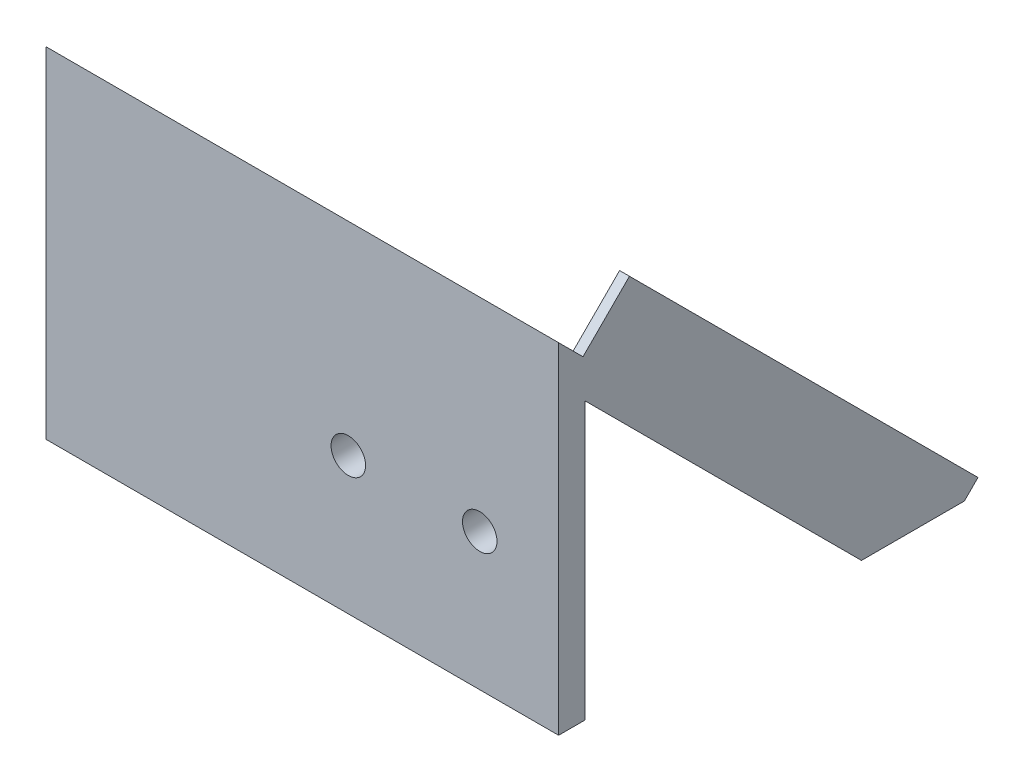
ISO-10303-21;
HEADER;
FILE_DESCRIPTION(('STEP AP214'),'2;1');
FILE_NAME('part.step','',(''),(''),'','','');
FILE_SCHEMA(('AUTOMOTIVE_DESIGN { 1 0 10303 214 1 1 1 1 }'));
ENDSEC;
DATA;
#1=APPLICATION_CONTEXT('core data for automotive mechanical design processes');
#2=APPLICATION_PROTOCOL_DEFINITION('international standard','automotive_design',2000,#1);
#3=PRODUCT_CONTEXT('',#1,'mechanical');
#4=PRODUCT('Part','Part','',(#3));
#5=PRODUCT_RELATED_PRODUCT_CATEGORY('part','',(#4));
#6=PRODUCT_DEFINITION_FORMATION('','',#4);
#7=PRODUCT_DEFINITION_CONTEXT('part definition',#1,'design');
#8=PRODUCT_DEFINITION('design','',#6,#7);
#9=PRODUCT_DEFINITION_SHAPE('','',#8);
#10=(LENGTH_UNIT() NAMED_UNIT(*) SI_UNIT(.MILLI.,.METRE.));
#11=(NAMED_UNIT(*) PLANE_ANGLE_UNIT() SI_UNIT($,.RADIAN.));
#12=(NAMED_UNIT(*) SI_UNIT($,.STERADIAN.) SOLID_ANGLE_UNIT());
#13=UNCERTAINTY_MEASURE_WITH_UNIT(LENGTH_MEASURE(1.E-05),#10,'distance_accuracy_value','');
#14=(GEOMETRIC_REPRESENTATION_CONTEXT(3) GLOBAL_UNCERTAINTY_ASSIGNED_CONTEXT((#13)) GLOBAL_UNIT_ASSIGNED_CONTEXT((#10,
#11,#12)) REPRESENTATION_CONTEXT('',''));
#15=CARTESIAN_POINT('',(0.,0.,0.));
#16=DIRECTION('',(0.,0.,1.));
#17=DIRECTION('',(1.,0.,0.));
#18=AXIS2_PLACEMENT_3D('',#15,#16,#17);
#19=CARTESIAN_POINT('',(78.,56.74,0.));
#20=DIRECTION('',(0.,-0.707106781186548,0.707106781186547));
#21=DIRECTION('',(0.,-0.707106781186547,-0.707106781186548));
#22=AXIS2_PLACEMENT_3D('',#19,#20,#21);
#23=PLANE('',#22);
#24=DIRECTION('',(0.,0.707106781186547,0.707106781186548));
#25=VECTOR('',#24,1.);
#26=CARTESIAN_POINT('',(76.5,0.,-56.7400000000001));
#27=LINE('',#26,#25);
#28=CARTESIAN_POINT('',(76.5,5.,-51.7400000000001));
#29=VERTEX_POINT('',#28);
#30=CARTESIAN_POINT('',(76.5,53.033008588991,-3.70699141100899));
#31=VERTEX_POINT('',#30);
#32=EDGE_CURVE('E202',#29,#31,#27,.T.);
#33=ORIENTED_EDGE('',*,*,#32,.F.);
#34=DIRECTION('',(-1.,0.,0.));
#35=VECTOR('',#34,1.);
#36=CARTESIAN_POINT('',(78.,5.00000000000001,-51.7400000000001));
#37=LINE('',#36,#35);
#38=CARTESIAN_POINT('',(0.,4.99999999999999,-51.7400000000001));
#39=VERTEX_POINT('',#38);
#40=EDGE_CURVE('E62',#29,#39,#37,.T.);
#41=ORIENTED_EDGE('',*,*,#40,.T.);
#42=DIRECTION('',(0.,0.707106781186547,0.707106781186548));
#43=VECTOR('',#42,1.);
#44=CARTESIAN_POINT('',(0.,56.74,0.));
#45=LINE('',#44,#43);
#46=CARTESIAN_POINT('',(0.,56.74,0.));
#47=VERTEX_POINT('',#46);
#48=EDGE_CURVE('E155',#39,#47,#45,.T.);
#49=ORIENTED_EDGE('',*,*,#48,.T.);
#50=DIRECTION('',(-1.,0.,0.));
#51=VECTOR('',#50,1.);
#52=CARTESIAN_POINT('',(78.,56.74,0.));
#53=LINE('',#52,#51);
#54=CARTESIAN_POINT('',(78.,56.74,0.));
#55=VERTEX_POINT('',#54);
#56=EDGE_CURVE('E138',#55,#47,#53,.T.);
#57=ORIENTED_EDGE('',*,*,#56,.F.);
#58=DIRECTION('',(0.,0.707106781186547,0.707106781186548));
#59=VECTOR('',#58,1.);
#60=CARTESIAN_POINT('',(78.,56.74,0.));
#61=LINE('',#60,#59);
#62=CARTESIAN_POINT('',(78.,53.033008588991,-3.70699141100899));
#63=VERTEX_POINT('',#62);
#64=EDGE_CURVE('E135',#63,#55,#61,.T.);
#65=ORIENTED_EDGE('',*,*,#64,.F.);
#66=DIRECTION('',(1.,0.,0.));
#67=VECTOR('',#66,1.);
#68=CARTESIAN_POINT('',(78.,53.033008588991,-3.70699141100899));
#69=LINE('',#68,#67);
#70=EDGE_CURVE('E214',#31,#63,#69,.T.);
#71=ORIENTED_EDGE('',*,*,#70,.F.);
#72=EDGE_LOOP('',(#33,#41,#49,#57,#65,#71));
#73=FACE_BOUND('',#72,.T.);
#74=ADVANCED_FACE('F38',(#73),#23,.F.);
#75=CARTESIAN_POINT('',(78.,0.,-4.));
#76=DIRECTION('',(0.,0.,1.));
#77=DIRECTION('',(1.,0.,0.));
#78=AXIS2_PLACEMENT_3D('',#75,#76,#77);
#79=PLANE('',#78);
#80=CARTESIAN_POINT('',(66.,25.86,-4.));
#81=DIRECTION('',(0.,0.,1.));
#82=DIRECTION('',(1.,0.,0.));
#83=AXIS2_PLACEMENT_3D('',#80,#81,#82);
#84=CIRCLE('',#83,2.625);
#85=CARTESIAN_POINT('',(68.625,25.86,-4.00000000000001));
#86=VERTEX_POINT('',#85);
#87=EDGE_CURVE('E197',#86,#86,#84,.F.);
#88=ORIENTED_EDGE('',*,*,#87,.F.);
#89=EDGE_LOOP('',(#88));
#90=FACE_BOUND('',#89,.T.);
#91=CARTESIAN_POINT('',(46.,25.86,-4.));
#92=DIRECTION('',(0.,0.,1.));
#93=DIRECTION('',(1.,0.,0.));
#94=AXIS2_PLACEMENT_3D('',#91,#92,#93);
#95=CIRCLE('',#94,2.62499999999999);
#96=CARTESIAN_POINT('',(48.625,25.86,-4.00000000000001));
#97=VERTEX_POINT('',#96);
#98=EDGE_CURVE('E198',#97,#97,#95,.F.);
#99=ORIENTED_EDGE('',*,*,#98,.F.);
#100=EDGE_LOOP('',(#99));
#101=FACE_BOUND('',#100,.T.);
#102=DIRECTION('',(0.,1.,0.));
#103=VECTOR('',#102,1.);
#104=CARTESIAN_POINT('',(78.,0.,-4.));
#105=LINE('',#104,#103);
#106=CARTESIAN_POINT('',(78.,5.,-4.));
#107=VERTEX_POINT('',#106);
#108=CARTESIAN_POINT('',(78.,47.08,-4.));
#109=VERTEX_POINT('',#108);
#110=EDGE_CURVE('E159',#107,#109,#105,.T.);
#111=ORIENTED_EDGE('',*,*,#110,.F.);
#112=DIRECTION('',(-1.,0.,0.));
#113=VECTOR('',#112,1.);
#114=CARTESIAN_POINT('',(78.,5.,-4.));
#115=LINE('',#114,#113);
#116=CARTESIAN_POINT('',(0.,4.99999999999999,-4.));
#117=VERTEX_POINT('',#116);
#118=EDGE_CURVE('E116',#107,#117,#115,.T.);
#119=ORIENTED_EDGE('',*,*,#118,.T.);
#120=DIRECTION('',(0.,1.,0.));
#121=VECTOR('',#120,1.);
#122=CARTESIAN_POINT('',(0.,0.,-4.));
#123=LINE('',#122,#121);
#124=CARTESIAN_POINT('',(0.,47.08,-4.));
#125=VERTEX_POINT('',#124);
#126=EDGE_CURVE('E147',#117,#125,#123,.T.);
#127=ORIENTED_EDGE('',*,*,#126,.T.);
#128=DIRECTION('',(-1.,0.,0.));
#129=VECTOR('',#128,1.);
#130=CARTESIAN_POINT('',(78.,47.08,-4.));
#131=LINE('',#130,#129);
#132=EDGE_CURVE('E47',#109,#125,#131,.T.);
#133=ORIENTED_EDGE('',*,*,#132,.F.);
#134=EDGE_LOOP('',(#111,#119,#127,#133));
#135=FACE_BOUND('',#134,.T.);
#136=ADVANCED_FACE('F40',(#90,#101,#135),#79,.F.);
#137=CARTESIAN_POINT('',(78.,47.08,-4.));
#138=DIRECTION('',(0.,0.707106781186553,-0.707106781186542));
#139=DIRECTION('',(0.,0.707106781186542,0.707106781186553));
#140=AXIS2_PLACEMENT_3D('',#137,#138,#139);
#141=PLANE('',#140);
#142=DIRECTION('',(0.,-0.707106781186542,-0.707106781186553));
#143=VECTOR('',#142,1.);
#144=CARTESIAN_POINT('',(0.,47.08,-4.));
#145=LINE('',#144,#143);
#146=CARTESIAN_POINT('',(0.,4.99999999999999,-46.0800000000006));
#147=VERTEX_POINT('',#146);
#148=EDGE_CURVE('E150',#125,#147,#145,.T.);
#149=ORIENTED_EDGE('',*,*,#148,.T.);
#150=DIRECTION('',(1.,0.,0.));
#151=VECTOR('',#150,1.);
#152=CARTESIAN_POINT('',(78.,5.,-46.0800000000006));
#153=LINE('',#152,#151);
#154=CARTESIAN_POINT('',(78.,5.,-46.0800000000006));
#155=VERTEX_POINT('',#154);
#156=EDGE_CURVE('E187',#147,#155,#153,.T.);
#157=ORIENTED_EDGE('',*,*,#156,.T.);
#158=DIRECTION('',(0.,-0.707106781186542,-0.707106781186553));
#159=VECTOR('',#158,1.);
#160=CARTESIAN_POINT('',(78.,47.08,-4.));
#161=LINE('',#160,#159);
#162=EDGE_CURVE('E143',#109,#155,#161,.T.);
#163=ORIENTED_EDGE('',*,*,#162,.F.);
#164=ORIENTED_EDGE('',*,*,#132,.T.);
#165=EDGE_LOOP('',(#149,#157,#163,#164));
#166=FACE_BOUND('',#165,.T.);
#167=ADVANCED_FACE('F166',(#166),#141,.F.);
#168=CARTESIAN_POINT('',(78.,0.,0.));
#169=DIRECTION('',(0.,0.,-1.));
#170=DIRECTION('',(-1.,0.,0.));
#171=AXIS2_PLACEMENT_3D('',#168,#169,#170);
#172=PLANE('',#171);
#173=CARTESIAN_POINT('',(66.,25.86,0.));
#174=DIRECTION('',(0.,0.,1.));
#175=DIRECTION('',(1.,0.,0.));
#176=AXIS2_PLACEMENT_3D('',#173,#174,#175);
#177=CIRCLE('',#176,2.625);
#178=CARTESIAN_POINT('',(68.625,25.86,0.));
#179=VERTEX_POINT('',#178);
#180=EDGE_CURVE('E193',#179,#179,#177,.T.);
#181=ORIENTED_EDGE('',*,*,#180,.F.);
#182=EDGE_LOOP('',(#181));
#183=FACE_BOUND('',#182,.T.);
#184=CARTESIAN_POINT('',(46.,25.86,0.));
#185=DIRECTION('',(0.,0.,1.));
#186=DIRECTION('',(1.,0.,0.));
#187=AXIS2_PLACEMENT_3D('',#184,#185,#186);
#188=CIRCLE('',#187,2.62499999999999);
#189=CARTESIAN_POINT('',(48.625,25.86,0.));
#190=VERTEX_POINT('',#189);
#191=EDGE_CURVE('E192',#190,#190,#188,.T.);
#192=ORIENTED_EDGE('',*,*,#191,.F.);
#193=EDGE_LOOP('',(#192));
#194=FACE_BOUND('',#193,.T.);
#195=DIRECTION('',(0.,-1.,0.));
#196=VECTOR('',#195,1.);
#197=CARTESIAN_POINT('',(0.,0.,0.));
#198=LINE('',#197,#196);
#199=CARTESIAN_POINT('',(0.,5.,0.));
#200=VERTEX_POINT('',#199);
#201=EDGE_CURVE('E130',#47,#200,#198,.T.);
#202=ORIENTED_EDGE('',*,*,#201,.T.);
#203=DIRECTION('',(-1.,0.,0.));
#204=VECTOR('',#203,1.);
#205=CARTESIAN_POINT('',(78.,5.,0.));
#206=LINE('',#205,#204);
#207=CARTESIAN_POINT('',(78.,5.,0.));
#208=VERTEX_POINT('',#207);
#209=EDGE_CURVE('E54',#208,#200,#206,.T.);
#210=ORIENTED_EDGE('',*,*,#209,.F.);
#211=DIRECTION('',(0.,-1.,0.));
#212=VECTOR('',#211,1.);
#213=CARTESIAN_POINT('',(78.,0.,0.));
#214=LINE('',#213,#212);
#215=EDGE_CURVE('E128',#55,#208,#214,.T.);
#216=ORIENTED_EDGE('',*,*,#215,.F.);
#217=ORIENTED_EDGE('',*,*,#56,.T.);
#218=EDGE_LOOP('',(#202,#210,#216,#217));
#219=FACE_BOUND('',#218,.T.);
#220=ADVANCED_FACE('F126',(#183,#194,#219),#172,.F.);
#221=CARTESIAN_POINT('',(78.,0.,0.));
#222=DIRECTION('',(-1.,0.,0.));
#223=DIRECTION('',(0.,0.,1.));
#224=AXIS2_PLACEMENT_3D('',#221,#222,#223);
#225=PLANE('',#224);
#226=ORIENTED_EDGE('',*,*,#215,.T.);
#227=DIRECTION('',(0.,0.,1.));
#228=VECTOR('',#227,1.);
#229=CARTESIAN_POINT('',(78.,5.,-63.8110678118656));
#230=LINE('',#229,#228);
#231=EDGE_CURVE('E113',#107,#208,#230,.T.);
#232=ORIENTED_EDGE('',*,*,#231,.F.);
#233=ORIENTED_EDGE('',*,*,#110,.T.);
#234=ORIENTED_EDGE('',*,*,#162,.T.);
#235=CARTESIAN_POINT('',(78.,5.,-61.7400000000001));
#236=VERTEX_POINT('',#235);
#237=EDGE_CURVE('E121',#236,#155,#230,.T.);
#238=ORIENTED_EDGE('',*,*,#237,.F.);
#239=DIRECTION('',(0.,-0.707106781186548,0.707106781186547));
#240=VECTOR('',#239,1.);
#241=CARTESIAN_POINT('',(78.,7.0710678118655,-63.8110678118656));
#242=LINE('',#241,#240);
#243=CARTESIAN_POINT('',(78.,7.0710678118655,-63.8110678118656));
#244=VERTEX_POINT('',#243);
#245=EDGE_CURVE('E151',#244,#236,#242,.T.);
#246=ORIENTED_EDGE('',*,*,#245,.F.);
#247=DIRECTION('',(0.,-0.707106781186547,-0.707106781186548));
#248=VECTOR('',#247,1.);
#249=CARTESIAN_POINT('',(78.,7.0710678118655,-63.8110678118656));
#250=LINE('',#249,#248);
#251=CARTESIAN_POINT('',(78.,60.1040764008565,-10.7780592228745));
#252=VERTEX_POINT('',#251);
#253=EDGE_CURVE('E209',#252,#244,#250,.T.);
#254=ORIENTED_EDGE('',*,*,#253,.F.);
#255=DIRECTION('',(0.,-0.707106781186548,0.707106781186547));
#256=VECTOR('',#255,1.);
#257=CARTESIAN_POINT('',(78.,60.1040764008565,-10.7780592228745));
#258=LINE('',#257,#256);
#259=EDGE_CURVE('E223',#252,#63,#258,.T.);
#260=ORIENTED_EDGE('',*,*,#259,.T.);
#261=ORIENTED_EDGE('',*,*,#64,.T.);
#262=EDGE_LOOP('',(#226,#232,#233,#234,#238,#246,#254,#260,#261));
#263=FACE_BOUND('',#262,.T.);
#264=ADVANCED_FACE('F133',(#263),#225,.F.);
#265=CARTESIAN_POINT('',(0.,0.,0.));
#266=DIRECTION('',(-1.,0.,0.));
#267=DIRECTION('',(0.,0.,1.));
#268=AXIS2_PLACEMENT_3D('',#265,#266,#267);
#269=PLANE('',#268);
#270=DIRECTION('',(0.,0.,1.));
#271=VECTOR('',#270,1.);
#272=CARTESIAN_POINT('',(0.,4.99999999999999,-63.8110678118656));
#273=LINE('',#272,#271);
#274=EDGE_CURVE('E178',#117,#200,#273,.T.);
#275=ORIENTED_EDGE('',*,*,#274,.T.);
#276=ORIENTED_EDGE('',*,*,#201,.F.);
#277=ORIENTED_EDGE('',*,*,#48,.F.);
#278=EDGE_CURVE('E175',#39,#147,#273,.T.);
#279=ORIENTED_EDGE('',*,*,#278,.T.);
#280=ORIENTED_EDGE('',*,*,#148,.F.);
#281=ORIENTED_EDGE('',*,*,#126,.F.);
#282=EDGE_LOOP('',(#275,#276,#277,#279,#280,#281));
#283=FACE_BOUND('',#282,.T.);
#284=ADVANCED_FACE('F173',(#283),#269,.T.);
#285=CARTESIAN_POINT('',(78.,7.0710678118655,-63.8110678118656));
#286=DIRECTION('',(0.,0.707106781186547,0.707106781186548));
#287=DIRECTION('',(0.,-0.707106781186548,0.707106781186547));
#288=AXIS2_PLACEMENT_3D('',#285,#286,#287);
#289=PLANE('',#288);
#290=ORIENTED_EDGE('',*,*,#245,.T.);
#291=DIRECTION('',(-1.,0.,0.));
#292=VECTOR('',#291,1.);
#293=CARTESIAN_POINT('',(78.,5.,-61.7400000000001));
#294=LINE('',#293,#292);
#295=CARTESIAN_POINT('',(76.5,5.,-61.7400000000001));
#296=VERTEX_POINT('',#295);
#297=EDGE_CURVE('E177',#236,#296,#294,.T.);
#298=ORIENTED_EDGE('',*,*,#297,.T.);
#299=DIRECTION('',(0.,-0.707106781186548,0.707106781186547));
#300=VECTOR('',#299,1.);
#301=CARTESIAN_POINT('',(76.5,7.0710678118655,-63.8110678118656));
#302=LINE('',#301,#300);
#303=CARTESIAN_POINT('',(76.5,7.0710678118655,-63.8110678118656));
#304=VERTEX_POINT('',#303);
#305=EDGE_CURVE('E235',#304,#296,#302,.T.);
#306=ORIENTED_EDGE('',*,*,#305,.F.);
#307=DIRECTION('',(-1.,0.,0.));
#308=VECTOR('',#307,1.);
#309=CARTESIAN_POINT('',(78.,7.0710678118655,-63.8110678118656));
#310=LINE('',#309,#308);
#311=EDGE_CURVE('E213',#244,#304,#310,.T.);
#312=ORIENTED_EDGE('',*,*,#311,.F.);
#313=EDGE_LOOP('',(#290,#298,#306,#312));
#314=FACE_BOUND('',#313,.T.);
#315=ADVANCED_FACE('F282',(#314),#289,.F.);
#316=CARTESIAN_POINT('',(76.5,7.0710678118655,-63.8110678118656));
#317=DIRECTION('',(1.,0.,0.));
#318=DIRECTION('',(0.,0.,-1.));
#319=AXIS2_PLACEMENT_3D('',#316,#317,#318);
#320=PLANE('',#319);
#321=ORIENTED_EDGE('',*,*,#305,.T.);
#322=DIRECTION('',(0.,0.,1.));
#323=VECTOR('',#322,1.);
#324=CARTESIAN_POINT('',(76.5,5.,-63.8110678118656));
#325=LINE('',#324,#323);
#326=EDGE_CURVE('E11',#296,#29,#325,.T.);
#327=ORIENTED_EDGE('',*,*,#326,.T.);
#328=ORIENTED_EDGE('',*,*,#32,.T.);
#329=DIRECTION('',(0.,-0.707106781186548,0.707106781186547));
#330=VECTOR('',#329,1.);
#331=CARTESIAN_POINT('',(76.5,60.1040764008565,-10.7780592228745));
#332=LINE('',#331,#330);
#333=CARTESIAN_POINT('',(76.5,60.1040764008565,-10.7780592228745));
#334=VERTEX_POINT('',#333);
#335=EDGE_CURVE('E231',#334,#31,#332,.T.);
#336=ORIENTED_EDGE('',*,*,#335,.F.);
#337=DIRECTION('',(0.,0.707106781186547,0.707106781186548));
#338=VECTOR('',#337,1.);
#339=CARTESIAN_POINT('',(76.5,7.0710678118655,-63.8110678118656));
#340=LINE('',#339,#338);
#341=EDGE_CURVE('E217',#304,#334,#340,.T.);
#342=ORIENTED_EDGE('',*,*,#341,.F.);
#343=EDGE_LOOP('',(#321,#327,#328,#336,#342));
#344=FACE_BOUND('',#343,.T.);
#345=ADVANCED_FACE('F278',(#344),#320,.F.);
#346=CARTESIAN_POINT('',(78.,60.1040764008565,-10.7780592228745));
#347=DIRECTION('',(0.,-0.707106781186547,-0.707106781186548));
#348=DIRECTION('',(0.,0.707106781186548,-0.707106781186547));
#349=AXIS2_PLACEMENT_3D('',#346,#347,#348);
#350=PLANE('',#349);
#351=ORIENTED_EDGE('',*,*,#70,.T.);
#352=ORIENTED_EDGE('',*,*,#259,.F.);
#353=DIRECTION('',(1.,0.,0.));
#354=VECTOR('',#353,1.);
#355=CARTESIAN_POINT('',(78.,60.1040764008565,-10.7780592228745));
#356=LINE('',#355,#354);
#357=EDGE_CURVE('E220',#334,#252,#356,.T.);
#358=ORIENTED_EDGE('',*,*,#357,.F.);
#359=ORIENTED_EDGE('',*,*,#335,.T.);
#360=EDGE_LOOP('',(#351,#352,#358,#359));
#361=FACE_BOUND('',#360,.T.);
#362=ADVANCED_FACE('F271',(#361),#350,.F.);
#363=CARTESIAN_POINT('',(0.,35.4410678118655,-35.4410678118655));
#364=DIRECTION('',(0.,-0.707106781186548,0.707106781186547));
#365=DIRECTION('',(0.,-0.707106781186547,-0.707106781186548));
#366=AXIS2_PLACEMENT_3D('',#363,#364,#365);
#367=PLANE('',#366);
#368=ORIENTED_EDGE('',*,*,#253,.T.);
#369=ORIENTED_EDGE('',*,*,#311,.T.);
#370=ORIENTED_EDGE('',*,*,#341,.T.);
#371=ORIENTED_EDGE('',*,*,#357,.T.);
#372=EDGE_LOOP('',(#368,#369,#370,#371));
#373=FACE_BOUND('',#372,.T.);
#374=ADVANCED_FACE('F261',(#373),#367,.F.);
#375=CARTESIAN_POINT('',(46.,25.86,-63.8120678118656));
#376=DIRECTION('',(0.,0.,1.));
#377=DIRECTION('',(1.,0.,0.));
#378=AXIS2_PLACEMENT_3D('',#375,#376,#377);
#379=CYLINDRICAL_SURFACE('',#378,2.62499999999999);
#380=CARTESIAN_POINT('',(48.625,25.86,0.));
#381=CARTESIAN_POINT('',(48.625,25.86,-0.0416666666666805));
#382=CARTESIAN_POINT('',(48.625,25.86,-0.0833333333333473));
#383=CARTESIAN_POINT('',(48.625,25.86,-0.166666666666681));
#384=CARTESIAN_POINT('',(48.625,25.86,-0.208333333333347));
#385=CARTESIAN_POINT('',(48.625,25.86,-0.291666666666681));
#386=CARTESIAN_POINT('',(48.625,25.86,-0.333333333333347));
#387=CARTESIAN_POINT('',(48.625,25.86,-0.416666666666681));
#388=CARTESIAN_POINT('',(48.625,25.86,-0.458333333333348));
#389=CARTESIAN_POINT('',(48.625,25.86,-0.541666666666681));
#390=CARTESIAN_POINT('',(48.625,25.86,-0.583333333333348));
#391=CARTESIAN_POINT('',(48.625,25.86,-0.666666666666681));
#392=CARTESIAN_POINT('',(48.625,25.86,-0.708333333333348));
#393=CARTESIAN_POINT('',(48.625,25.86,-0.791666666666681));
#394=CARTESIAN_POINT('',(48.625,25.86,-0.833333333333348));
#395=CARTESIAN_POINT('',(48.625,25.86,-0.916666666666681));
#396=CARTESIAN_POINT('',(48.625,25.86,-0.958333333333348));
#397=CARTESIAN_POINT('',(48.625,25.86,-1.04166666666668));
#398=CARTESIAN_POINT('',(48.625,25.86,-1.08333333333335));
#399=CARTESIAN_POINT('',(48.625,25.86,-1.16666666666668));
#400=CARTESIAN_POINT('',(48.625,25.86,-1.20833333333335));
#401=CARTESIAN_POINT('',(48.625,25.86,-1.29166666666668));
#402=CARTESIAN_POINT('',(48.625,25.86,-1.33333333333334));
#403=CARTESIAN_POINT('',(48.625,25.86,-1.41666666666667));
#404=CARTESIAN_POINT('',(48.625,25.86,-1.45833333333334));
#405=CARTESIAN_POINT('',(48.625,25.86,-1.54166666666667));
#406=CARTESIAN_POINT('',(48.625,25.86,-1.58333333333334));
#407=CARTESIAN_POINT('',(48.625,25.86,-1.66666666666667));
#408=CARTESIAN_POINT('',(48.625,25.86,-1.70833333333334));
#409=CARTESIAN_POINT('',(48.625,25.86,-1.79166666666668));
#410=CARTESIAN_POINT('',(48.625,25.86,-1.83333333333334));
#411=CARTESIAN_POINT('',(48.625,25.86,-1.91666666666668));
#412=CARTESIAN_POINT('',(48.625,25.86,-1.95833333333334));
#413=CARTESIAN_POINT('',(48.625,25.86,-2.04166666666668));
#414=CARTESIAN_POINT('',(48.625,25.86,-2.08333333333334));
#415=CARTESIAN_POINT('',(48.625,25.86,-2.16666666666668));
#416=CARTESIAN_POINT('',(48.625,25.86,-2.20833333333334));
#417=CARTESIAN_POINT('',(48.625,25.86,-2.29166666666668));
#418=CARTESIAN_POINT('',(48.625,25.86,-2.33333333333334));
#419=CARTESIAN_POINT('',(48.625,25.86,-2.41666666666668));
#420=CARTESIAN_POINT('',(48.625,25.86,-2.45833333333334));
#421=CARTESIAN_POINT('',(48.625,25.86,-2.54166666666668));
#422=CARTESIAN_POINT('',(48.625,25.86,-2.58333333333334));
#423=CARTESIAN_POINT('',(48.625,25.86,-2.66666666666668));
#424=CARTESIAN_POINT('',(48.625,25.86,-2.70833333333334));
#425=CARTESIAN_POINT('',(48.625,25.86,-2.79166666666668));
#426=CARTESIAN_POINT('',(48.625,25.86,-2.83333333333334));
#427=CARTESIAN_POINT('',(48.625,25.86,-2.91666666666668));
#428=CARTESIAN_POINT('',(48.625,25.86,-2.95833333333334));
#429=CARTESIAN_POINT('',(48.625,25.86,-3.04166666666668));
#430=CARTESIAN_POINT('',(48.625,25.86,-3.08333333333334));
#431=CARTESIAN_POINT('',(48.625,25.86,-3.16666666666668));
#432=CARTESIAN_POINT('',(48.625,25.86,-3.20833333333334));
#433=CARTESIAN_POINT('',(48.625,25.86,-3.29166666666668));
#434=CARTESIAN_POINT('',(48.625,25.86,-3.33333333333334));
#435=CARTESIAN_POINT('',(48.625,25.86,-3.41666666666668));
#436=CARTESIAN_POINT('',(48.625,25.86,-3.45833333333334));
#437=CARTESIAN_POINT('',(48.625,25.86,-3.54166666666668));
#438=CARTESIAN_POINT('',(48.625,25.86,-3.58333333333334));
#439=CARTESIAN_POINT('',(48.625,25.86,-3.66666666666668));
#440=CARTESIAN_POINT('',(48.625,25.86,-3.70833333333334));
#441=CARTESIAN_POINT('',(48.625,25.86,-3.79166666666668));
#442=CARTESIAN_POINT('',(48.625,25.86,-3.83333333333334));
#443=CARTESIAN_POINT('',(48.625,25.86,-3.91666666666668));
#444=CARTESIAN_POINT('',(48.625,25.86,-3.95833333333334));
#445=CARTESIAN_POINT('',(48.625,25.86,-4.00000000000001));
#446=B_SPLINE_CURVE_WITH_KNOTS('',3,(#380,#381,#382,#383,#384,#385,#386,#387,#388,#389,#390,
#391,#392,#393,#394,#395,#396,#397,#398,#399,#400,#401,#402,#403,#404,#405,#406,#407,#408,#409,
#410,#411,#412,#413,#414,#415,#416,#417,#418,#419,#420,#421,#422,#423,#424,#425,#426,#427,#428,
#429,#430,#431,#432,#433,#434,#435,#436,#437,#438,#439,#440,#441,#442,#443,#444,#445),
.UNSPECIFIED.,.F.,.F.,(4,2,2,2,2,2,2,2,2,2,2,2,2,2,2,2,2,2,2,2,2,2,2,2,2,2,2,2,2,2,2,2,4),(0.,
0.125,0.25,0.375,0.5,0.625000000000001,0.750000000000001,0.875000000000001,1.,1.125,1.25,
1.37499999999999,1.49999999999999,1.62499999999999,1.74999999999999,1.87499999999999,
1.99999999999999,2.125,2.25,2.375,2.5,2.625,2.75,2.875,3.,3.125,3.25,3.375,3.5,3.625,3.75,3.875,
4.),.UNSPECIFIED.);
#447=EDGE_CURVE('BSEAM258',#190,#97,#446,.T.);
#448=ORIENTED_EDGE('',*,*,#191,.T.);
#449=ORIENTED_EDGE('',*,*,#98,.T.);
#450=ORIENTED_EDGE('',*,*,#447,.T.);
#451=ORIENTED_EDGE('',*,*,#447,.F.);
#452=EDGE_LOOP('',(#448,#450,#449,#451));
#453=FACE_BOUND('',#452,.T.);
#454=ADVANCED_FACE('F258',(#453),#379,.F.);
#455=CARTESIAN_POINT('',(66.,25.86,-63.8120678118656));
#456=DIRECTION('',(0.,0.,1.));
#457=DIRECTION('',(1.,0.,0.));
#458=AXIS2_PLACEMENT_3D('',#455,#456,#457);
#459=CYLINDRICAL_SURFACE('',#458,2.625);
#460=CARTESIAN_POINT('',(68.625,25.86,0.));
#461=CARTESIAN_POINT('',(68.625,25.86,-0.0416666666666805));
#462=CARTESIAN_POINT('',(68.625,25.86,-0.0833333333333473));
#463=CARTESIAN_POINT('',(68.625,25.86,-0.166666666666681));
#464=CARTESIAN_POINT('',(68.625,25.86,-0.208333333333347));
#465=CARTESIAN_POINT('',(68.625,25.86,-0.291666666666681));
#466=CARTESIAN_POINT('',(68.625,25.86,-0.333333333333347));
#467=CARTESIAN_POINT('',(68.625,25.86,-0.416666666666681));
#468=CARTESIAN_POINT('',(68.625,25.86,-0.458333333333348));
#469=CARTESIAN_POINT('',(68.625,25.86,-0.541666666666681));
#470=CARTESIAN_POINT('',(68.625,25.86,-0.583333333333348));
#471=CARTESIAN_POINT('',(68.625,25.86,-0.666666666666681));
#472=CARTESIAN_POINT('',(68.625,25.86,-0.708333333333348));
#473=CARTESIAN_POINT('',(68.625,25.86,-0.791666666666681));
#474=CARTESIAN_POINT('',(68.625,25.86,-0.833333333333348));
#475=CARTESIAN_POINT('',(68.625,25.86,-0.916666666666681));
#476=CARTESIAN_POINT('',(68.625,25.86,-0.958333333333348));
#477=CARTESIAN_POINT('',(68.625,25.86,-1.04166666666668));
#478=CARTESIAN_POINT('',(68.625,25.86,-1.08333333333335));
#479=CARTESIAN_POINT('',(68.625,25.86,-1.16666666666668));
#480=CARTESIAN_POINT('',(68.625,25.86,-1.20833333333335));
#481=CARTESIAN_POINT('',(68.625,25.86,-1.29166666666668));
#482=CARTESIAN_POINT('',(68.625,25.86,-1.33333333333334));
#483=CARTESIAN_POINT('',(68.625,25.86,-1.41666666666667));
#484=CARTESIAN_POINT('',(68.625,25.86,-1.45833333333334));
#485=CARTESIAN_POINT('',(68.625,25.86,-1.54166666666667));
#486=CARTESIAN_POINT('',(68.625,25.86,-1.58333333333334));
#487=CARTESIAN_POINT('',(68.625,25.86,-1.66666666666667));
#488=CARTESIAN_POINT('',(68.625,25.86,-1.70833333333334));
#489=CARTESIAN_POINT('',(68.625,25.86,-1.79166666666668));
#490=CARTESIAN_POINT('',(68.625,25.86,-1.83333333333334));
#491=CARTESIAN_POINT('',(68.625,25.86,-1.91666666666668));
#492=CARTESIAN_POINT('',(68.625,25.86,-1.95833333333334));
#493=CARTESIAN_POINT('',(68.625,25.86,-2.04166666666668));
#494=CARTESIAN_POINT('',(68.625,25.86,-2.08333333333334));
#495=CARTESIAN_POINT('',(68.625,25.86,-2.16666666666668));
#496=CARTESIAN_POINT('',(68.625,25.86,-2.20833333333334));
#497=CARTESIAN_POINT('',(68.625,25.86,-2.29166666666668));
#498=CARTESIAN_POINT('',(68.625,25.86,-2.33333333333334));
#499=CARTESIAN_POINT('',(68.625,25.86,-2.41666666666668));
#500=CARTESIAN_POINT('',(68.625,25.86,-2.45833333333334));
#501=CARTESIAN_POINT('',(68.625,25.86,-2.54166666666668));
#502=CARTESIAN_POINT('',(68.625,25.86,-2.58333333333334));
#503=CARTESIAN_POINT('',(68.625,25.86,-2.66666666666668));
#504=CARTESIAN_POINT('',(68.625,25.86,-2.70833333333334));
#505=CARTESIAN_POINT('',(68.625,25.86,-2.79166666666668));
#506=CARTESIAN_POINT('',(68.625,25.86,-2.83333333333334));
#507=CARTESIAN_POINT('',(68.625,25.86,-2.91666666666668));
#508=CARTESIAN_POINT('',(68.625,25.86,-2.95833333333334));
#509=CARTESIAN_POINT('',(68.625,25.86,-3.04166666666668));
#510=CARTESIAN_POINT('',(68.625,25.86,-3.08333333333334));
#511=CARTESIAN_POINT('',(68.625,25.86,-3.16666666666668));
#512=CARTESIAN_POINT('',(68.625,25.86,-3.20833333333334));
#513=CARTESIAN_POINT('',(68.625,25.86,-3.29166666666668));
#514=CARTESIAN_POINT('',(68.625,25.86,-3.33333333333334));
#515=CARTESIAN_POINT('',(68.625,25.86,-3.41666666666668));
#516=CARTESIAN_POINT('',(68.625,25.86,-3.45833333333334));
#517=CARTESIAN_POINT('',(68.625,25.86,-3.54166666666668));
#518=CARTESIAN_POINT('',(68.625,25.86,-3.58333333333334));
#519=CARTESIAN_POINT('',(68.625,25.86,-3.66666666666668));
#520=CARTESIAN_POINT('',(68.625,25.86,-3.70833333333334));
#521=CARTESIAN_POINT('',(68.625,25.86,-3.79166666666668));
#522=CARTESIAN_POINT('',(68.625,25.86,-3.83333333333334));
#523=CARTESIAN_POINT('',(68.625,25.86,-3.91666666666668));
#524=CARTESIAN_POINT('',(68.625,25.86,-3.95833333333334));
#525=CARTESIAN_POINT('',(68.625,25.86,-4.00000000000001));
#526=B_SPLINE_CURVE_WITH_KNOTS('',3,(#460,#461,#462,#463,#464,#465,#466,#467,#468,#469,#470,
#471,#472,#473,#474,#475,#476,#477,#478,#479,#480,#481,#482,#483,#484,#485,#486,#487,#488,#489,
#490,#491,#492,#493,#494,#495,#496,#497,#498,#499,#500,#501,#502,#503,#504,#505,#506,#507,#508,
#509,#510,#511,#512,#513,#514,#515,#516,#517,#518,#519,#520,#521,#522,#523,#524,#525),
.UNSPECIFIED.,.F.,.F.,(4,2,2,2,2,2,2,2,2,2,2,2,2,2,2,2,2,2,2,2,2,2,2,2,2,2,2,2,2,2,2,2,4),(0.,
0.125,0.25,0.375,0.5,0.625000000000001,0.750000000000001,0.875000000000001,1.,1.125,1.25,
1.37499999999999,1.49999999999999,1.62499999999999,1.74999999999999,1.87499999999999,
1.99999999999999,2.125,2.25,2.375,2.5,2.625,2.75,2.875,3.,3.125,3.25,3.375,3.5,3.625,3.75,3.875,
4.),.UNSPECIFIED.);
#527=EDGE_CURVE('BSEAM260',#179,#86,#526,.T.);
#528=ORIENTED_EDGE('',*,*,#180,.T.);
#529=ORIENTED_EDGE('',*,*,#87,.T.);
#530=ORIENTED_EDGE('',*,*,#527,.T.);
#531=ORIENTED_EDGE('',*,*,#527,.F.);
#532=EDGE_LOOP('',(#528,#530,#529,#531));
#533=FACE_BOUND('',#532,.T.);
#534=ADVANCED_FACE('F260',(#533),#459,.F.);
#535=CARTESIAN_POINT('',(78.,5.,-63.8110678118656));
#536=DIRECTION('',(0.,1.,0.));
#537=DIRECTION('',(-1.,0.,0.));
#538=AXIS2_PLACEMENT_3D('',#535,#536,#537);
#539=PLANE('',#538);
#540=ORIENTED_EDGE('',*,*,#278,.F.);
#541=ORIENTED_EDGE('',*,*,#40,.F.);
#542=ORIENTED_EDGE('',*,*,#326,.F.);
#543=ORIENTED_EDGE('',*,*,#297,.F.);
#544=ORIENTED_EDGE('',*,*,#237,.T.);
#545=ORIENTED_EDGE('',*,*,#156,.F.);
#546=EDGE_LOOP('',(#540,#541,#542,#543,#544,#545));
#547=FACE_BOUND('',#546,.T.);
#548=ADVANCED_FACE('F268',(#547),#539,.F.);
#549=ORIENTED_EDGE('',*,*,#231,.T.);
#550=ORIENTED_EDGE('',*,*,#209,.T.);
#551=ORIENTED_EDGE('',*,*,#274,.F.);
#552=ORIENTED_EDGE('',*,*,#118,.F.);
#553=EDGE_LOOP('',(#549,#550,#551,#552));
#554=FACE_BOUND('',#553,.T.);
#555=ADVANCED_FACE('F114',(#554),#539,.F.);
#556=CLOSED_SHELL('',(#74,#136,#167,#220,#264,#284,#315,#345,#362,#374,#454,#534,#548,#555));
#557=MANIFOLD_SOLID_BREP('B2',#556);
#558=ADVANCED_BREP_SHAPE_REPRESENTATION('',(#18,#557),#14);
#559=SHAPE_DEFINITION_REPRESENTATION(#9,#558);
ENDSEC;
END-ISO-10303-21;
